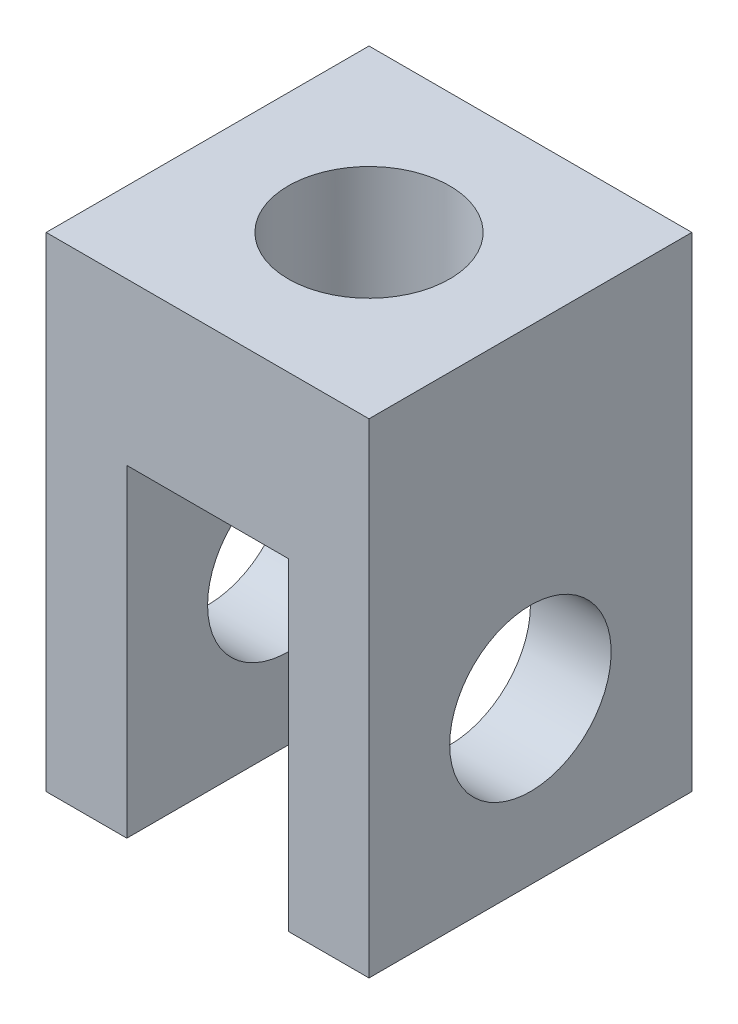
ISO-10303-21;
HEADER;
FILE_DESCRIPTION(('STEP AP214'),'2;1');
FILE_NAME('part.step','',(''),(''),'','','');
FILE_SCHEMA(('AUTOMOTIVE_DESIGN { 1 0 10303 214 1 1 1 1 }'));
ENDSEC;
DATA;
#1=APPLICATION_CONTEXT('core data for automotive mechanical design processes');
#2=APPLICATION_PROTOCOL_DEFINITION('international standard','automotive_design',2000,#1);
#3=PRODUCT_CONTEXT('',#1,'mechanical');
#4=PRODUCT('Part','Part','',(#3));
#5=PRODUCT_RELATED_PRODUCT_CATEGORY('part','',(#4));
#6=PRODUCT_DEFINITION_FORMATION('','',#4);
#7=PRODUCT_DEFINITION_CONTEXT('part definition',#1,'design');
#8=PRODUCT_DEFINITION('design','',#6,#7);
#9=PRODUCT_DEFINITION_SHAPE('','',#8);
#10=(LENGTH_UNIT() NAMED_UNIT(*) SI_UNIT(.MILLI.,.METRE.));
#11=(NAMED_UNIT(*) PLANE_ANGLE_UNIT() SI_UNIT($,.RADIAN.));
#12=(NAMED_UNIT(*) SI_UNIT($,.STERADIAN.) SOLID_ANGLE_UNIT());
#13=UNCERTAINTY_MEASURE_WITH_UNIT(LENGTH_MEASURE(1.E-05),#10,'distance_accuracy_value','');
#14=(GEOMETRIC_REPRESENTATION_CONTEXT(3) GLOBAL_UNCERTAINTY_ASSIGNED_CONTEXT((#13)) GLOBAL_UNIT_ASSIGNED_CONTEXT((#10,
#11,#12)) REPRESENTATION_CONTEXT('',''));
#15=CARTESIAN_POINT('',(0.,0.,0.));
#16=DIRECTION('',(0.,0.,1.));
#17=DIRECTION('',(1.,0.,0.));
#18=AXIS2_PLACEMENT_3D('',#15,#16,#17);
#19=CARTESIAN_POINT('',(0.,0.,0.));
#20=DIRECTION('',(0.,1.,0.));
#21=DIRECTION('',(0.,0.,1.));
#22=AXIS2_PLACEMENT_3D('',#19,#20,#21);
#23=PLANE('',#22);
#24=DIRECTION('',(0.,0.,-1.));
#25=VECTOR('',#24,1.);
#26=CARTESIAN_POINT('',(5.,0.,10.));
#27=LINE('',#26,#25);
#28=CARTESIAN_POINT('',(5.,0.,10.));
#29=VERTEX_POINT('',#28);
#30=CARTESIAN_POINT('',(5.,0.,0.));
#31=VERTEX_POINT('',#30);
#32=EDGE_CURVE('E137',#29,#31,#27,.T.);
#33=ORIENTED_EDGE('',*,*,#32,.F.);
#34=DIRECTION('',(1.,0.,0.));
#35=VECTOR('',#34,1.);
#36=CARTESIAN_POINT('',(-9.99999999999999,0.,10.));
#37=LINE('',#36,#35);
#38=CARTESIAN_POINT('',(-5.,0.,10.));
#39=VERTEX_POINT('',#38);
#40=EDGE_CURVE('E175',#39,#29,#37,.T.);
#41=ORIENTED_EDGE('',*,*,#40,.F.);
#42=DIRECTION('',(0.,0.,1.));
#43=VECTOR('',#42,1.);
#44=CARTESIAN_POINT('',(-5.,0.,10.));
#45=LINE('',#44,#43);
#46=CARTESIAN_POINT('',(-5.,0.,0.));
#47=VERTEX_POINT('',#46);
#48=EDGE_CURVE('E11',#47,#39,#45,.T.);
#49=ORIENTED_EDGE('',*,*,#48,.F.);
#50=CARTESIAN_POINT('',(0.,0.,0.));
#51=DIRECTION('',(0.,1.,0.));
#52=DIRECTION('',(0.,0.,1.));
#53=AXIS2_PLACEMENT_3D('',#50,#51,#52);
#54=CIRCLE('',#53,5.);
#55=EDGE_CURVE('E168',#47,#31,#54,.T.);
#56=ORIENTED_EDGE('',*,*,#55,.T.);
#57=EDGE_LOOP('',(#33,#41,#49,#56));
#58=FACE_BOUND('',#57,.T.);
#59=ADVANCED_FACE('F34',(#58),#23,.F.);
#60=CARTESIAN_POINT('',(5.,0.,-10.));
#61=VERTEX_POINT('',#60);
#62=EDGE_CURVE('E139',#31,#61,#27,.T.);
#63=ORIENTED_EDGE('',*,*,#62,.F.);
#64=EDGE_CURVE('E59',#31,#47,#54,.T.);
#65=ORIENTED_EDGE('',*,*,#64,.T.);
#66=CARTESIAN_POINT('',(-5.,0.,-10.));
#67=VERTEX_POINT('',#66);
#68=EDGE_CURVE('E45',#67,#47,#45,.T.);
#69=ORIENTED_EDGE('',*,*,#68,.F.);
#70=DIRECTION('',(-1.,0.,0.));
#71=VECTOR('',#70,1.);
#72=CARTESIAN_POINT('',(-10.,0.,-10.));
#73=LINE('',#72,#71);
#74=EDGE_CURVE('E52',#61,#67,#73,.T.);
#75=ORIENTED_EDGE('',*,*,#74,.F.);
#76=EDGE_LOOP('',(#63,#65,#69,#75));
#77=FACE_BOUND('',#76,.T.);
#78=ADVANCED_FACE('F207',(#77),#23,.F.);
#79=CARTESIAN_POINT('',(10.,10.,-10.));
#80=DIRECTION('',(-1.,0.,0.));
#81=DIRECTION('',(0.,0.,1.));
#82=AXIS2_PLACEMENT_3D('',#79,#80,#81);
#83=PLANE('',#82);
#84=CARTESIAN_POINT('',(10.,-10.,0.));
#85=DIRECTION('',(-1.,0.,0.));
#86=DIRECTION('',(0.,0.,1.));
#87=AXIS2_PLACEMENT_3D('',#84,#85,#86);
#88=CIRCLE('',#87,5.);
#89=CARTESIAN_POINT('',(10.,-10.,5.));
#90=VERTEX_POINT('',#89);
#91=EDGE_CURVE('E238',#90,#90,#88,.T.);
#92=ORIENTED_EDGE('',*,*,#91,.T.);
#93=EDGE_LOOP('',(#92));
#94=FACE_BOUND('',#93,.T.);
#95=DIRECTION('',(0.,-1.,0.));
#96=VECTOR('',#95,1.);
#97=CARTESIAN_POINT('',(10.,10.,10.));
#98=LINE('',#97,#96);
#99=CARTESIAN_POINT('',(10.,10.,10.));
#100=VERTEX_POINT('',#99);
#101=CARTESIAN_POINT('',(10.,-20.,10.));
#102=VERTEX_POINT('',#101);
#103=EDGE_CURVE('E112',#100,#102,#98,.T.);
#104=ORIENTED_EDGE('',*,*,#103,.T.);
#105=DIRECTION('',(0.,0.,1.));
#106=VECTOR('',#105,1.);
#107=CARTESIAN_POINT('',(10.,-20.,10.));
#108=LINE('',#107,#106);
#109=CARTESIAN_POINT('',(10.,-20.,-10.));
#110=VERTEX_POINT('',#109);
#111=EDGE_CURVE('E116',#110,#102,#108,.T.);
#112=ORIENTED_EDGE('',*,*,#111,.F.);
#113=DIRECTION('',(0.,-1.,0.));
#114=VECTOR('',#113,1.);
#115=CARTESIAN_POINT('',(10.,10.,-10.));
#116=LINE('',#115,#114);
#117=CARTESIAN_POINT('',(10.,10.,-10.));
#118=VERTEX_POINT('',#117);
#119=EDGE_CURVE('E43',#118,#110,#116,.T.);
#120=ORIENTED_EDGE('',*,*,#119,.F.);
#121=DIRECTION('',(0.,0.,-1.));
#122=VECTOR('',#121,1.);
#123=CARTESIAN_POINT('',(10.,10.,-10.));
#124=LINE('',#123,#122);
#125=EDGE_CURVE('E118',#100,#118,#124,.T.);
#126=ORIENTED_EDGE('',*,*,#125,.F.);
#127=EDGE_LOOP('',(#104,#112,#120,#126));
#128=FACE_BOUND('',#127,.T.);
#129=ADVANCED_FACE('F36',(#94,#128),#83,.F.);
#130=CARTESIAN_POINT('',(-10.,10.,-10.));
#131=DIRECTION('',(0.,0.,1.));
#132=DIRECTION('',(1.,0.,0.));
#133=AXIS2_PLACEMENT_3D('',#130,#131,#132);
#134=PLANE('',#133);
#135=ORIENTED_EDGE('',*,*,#119,.T.);
#136=DIRECTION('',(1.,0.,0.));
#137=VECTOR('',#136,1.);
#138=CARTESIAN_POINT('',(10.,-20.,-10.));
#139=LINE('',#138,#137);
#140=CARTESIAN_POINT('',(5.,-20.,-10.));
#141=VERTEX_POINT('',#140);
#142=EDGE_CURVE('E136',#141,#110,#139,.T.);
#143=ORIENTED_EDGE('',*,*,#142,.F.);
#144=DIRECTION('',(0.,1.,0.));
#145=VECTOR('',#144,1.);
#146=CARTESIAN_POINT('',(5.,-20.,-10.));
#147=LINE('',#146,#145);
#148=EDGE_CURVE('E146',#141,#61,#147,.T.);
#149=ORIENTED_EDGE('',*,*,#148,.T.);
#150=ORIENTED_EDGE('',*,*,#74,.T.);
#151=DIRECTION('',(0.,1.,0.));
#152=VECTOR('',#151,1.);
#153=CARTESIAN_POINT('',(-5.,-20.,-10.));
#154=LINE('',#153,#152);
#155=CARTESIAN_POINT('',(-5.,-20.,-10.));
#156=VERTEX_POINT('',#155);
#157=EDGE_CURVE('E164',#156,#67,#154,.T.);
#158=ORIENTED_EDGE('',*,*,#157,.F.);
#159=DIRECTION('',(1.,0.,0.));
#160=VECTOR('',#159,1.);
#161=CARTESIAN_POINT('',(-10.,-20.,-10.));
#162=LINE('',#161,#160);
#163=CARTESIAN_POINT('',(-10.,-20.,-10.));
#164=VERTEX_POINT('',#163);
#165=EDGE_CURVE('E153',#164,#156,#162,.T.);
#166=ORIENTED_EDGE('',*,*,#165,.F.);
#167=DIRECTION('',(0.,-1.,0.));
#168=VECTOR('',#167,1.);
#169=CARTESIAN_POINT('',(-10.,10.,-10.));
#170=LINE('',#169,#168);
#171=CARTESIAN_POINT('',(-10.,10.,-10.));
#172=VERTEX_POINT('',#171);
#173=EDGE_CURVE('E183',#172,#164,#170,.T.);
#174=ORIENTED_EDGE('',*,*,#173,.F.);
#175=DIRECTION('',(-1.,0.,0.));
#176=VECTOR('',#175,1.);
#177=CARTESIAN_POINT('',(-10.,10.,-10.));
#178=LINE('',#177,#176);
#179=EDGE_CURVE('E174',#118,#172,#178,.T.);
#180=ORIENTED_EDGE('',*,*,#179,.F.);
#181=EDGE_LOOP('',(#135,#143,#149,#150,#158,#166,#174,#180));
#182=FACE_BOUND('',#181,.T.);
#183=ADVANCED_FACE('F184',(#182),#134,.F.);
#184=CARTESIAN_POINT('',(-10.,10.,-10.));
#185=DIRECTION('',(1.,0.,0.));
#186=DIRECTION('',(0.,0.,-1.));
#187=AXIS2_PLACEMENT_3D('',#184,#185,#186);
#188=PLANE('',#187);
#189=CARTESIAN_POINT('',(-10.,-10.,0.));
#190=DIRECTION('',(-1.,0.,0.));
#191=DIRECTION('',(0.,0.,1.));
#192=AXIS2_PLACEMENT_3D('',#189,#190,#191);
#193=CIRCLE('',#192,5.);
#194=CARTESIAN_POINT('',(-9.99999999999999,-10.,5.));
#195=VERTEX_POINT('',#194);
#196=EDGE_CURVE('E240',#195,#195,#193,.T.);
#197=ORIENTED_EDGE('',*,*,#196,.F.);
#198=EDGE_LOOP('',(#197));
#199=FACE_BOUND('',#198,.T.);
#200=ORIENTED_EDGE('',*,*,#173,.T.);
#201=DIRECTION('',(0.,0.,-1.));
#202=VECTOR('',#201,1.);
#203=CARTESIAN_POINT('',(-10.,-20.,10.));
#204=LINE('',#203,#202);
#205=CARTESIAN_POINT('',(-10.,-20.,10.));
#206=VERTEX_POINT('',#205);
#207=EDGE_CURVE('E150',#206,#164,#204,.T.);
#208=ORIENTED_EDGE('',*,*,#207,.F.);
#209=DIRECTION('',(0.,-1.,0.));
#210=VECTOR('',#209,1.);
#211=CARTESIAN_POINT('',(-9.99999999999999,10.,10.));
#212=LINE('',#211,#210);
#213=CARTESIAN_POINT('',(-9.99999999999999,10.,10.));
#214=VERTEX_POINT('',#213);
#215=EDGE_CURVE('E121',#214,#206,#212,.T.);
#216=ORIENTED_EDGE('',*,*,#215,.F.);
#217=DIRECTION('',(0.,0.,1.));
#218=VECTOR('',#217,1.);
#219=CARTESIAN_POINT('',(-10.,10.,-10.));
#220=LINE('',#219,#218);
#221=EDGE_CURVE('E177',#172,#214,#220,.T.);
#222=ORIENTED_EDGE('',*,*,#221,.F.);
#223=EDGE_LOOP('',(#200,#208,#216,#222));
#224=FACE_BOUND('',#223,.T.);
#225=ADVANCED_FACE('F198',(#199,#224),#188,.F.);
#226=CARTESIAN_POINT('',(-9.99999999999999,10.,10.));
#227=DIRECTION('',(0.,0.,-1.));
#228=DIRECTION('',(-1.,0.,0.));
#229=AXIS2_PLACEMENT_3D('',#226,#227,#228);
#230=PLANE('',#229);
#231=ORIENTED_EDGE('',*,*,#215,.T.);
#232=DIRECTION('',(-1.,0.,0.));
#233=VECTOR('',#232,1.);
#234=CARTESIAN_POINT('',(-10.,-20.,10.));
#235=LINE('',#234,#233);
#236=CARTESIAN_POINT('',(-5.,-20.,10.));
#237=VERTEX_POINT('',#236);
#238=EDGE_CURVE('E157',#237,#206,#235,.T.);
#239=ORIENTED_EDGE('',*,*,#238,.F.);
#240=DIRECTION('',(0.,1.,0.));
#241=VECTOR('',#240,1.);
#242=CARTESIAN_POINT('',(-5.,-20.,10.));
#243=LINE('',#242,#241);
#244=EDGE_CURVE('E159',#237,#39,#243,.T.);
#245=ORIENTED_EDGE('',*,*,#244,.T.);
#246=ORIENTED_EDGE('',*,*,#40,.T.);
#247=DIRECTION('',(0.,1.,0.));
#248=VECTOR('',#247,1.);
#249=CARTESIAN_POINT('',(5.,-20.,10.));
#250=LINE('',#249,#248);
#251=CARTESIAN_POINT('',(5.,-20.,10.));
#252=VERTEX_POINT('',#251);
#253=EDGE_CURVE('E128',#252,#29,#250,.T.);
#254=ORIENTED_EDGE('',*,*,#253,.F.);
#255=DIRECTION('',(-1.,0.,0.));
#256=VECTOR('',#255,1.);
#257=CARTESIAN_POINT('',(10.,-20.,10.));
#258=LINE('',#257,#256);
#259=EDGE_CURVE('E125',#102,#252,#258,.T.);
#260=ORIENTED_EDGE('',*,*,#259,.F.);
#261=ORIENTED_EDGE('',*,*,#103,.F.);
#262=DIRECTION('',(1.,0.,0.));
#263=VECTOR('',#262,1.);
#264=CARTESIAN_POINT('',(-9.99999999999999,10.,10.));
#265=LINE('',#264,#263);
#266=EDGE_CURVE('E122',#214,#100,#265,.T.);
#267=ORIENTED_EDGE('',*,*,#266,.F.);
#268=EDGE_LOOP('',(#231,#239,#245,#246,#254,#260,#261,#267));
#269=FACE_BOUND('',#268,.T.);
#270=ADVANCED_FACE('F126',(#269),#230,.F.);
#271=CARTESIAN_POINT('',(0.,10.,0.));
#272=DIRECTION('',(0.,1.,0.));
#273=DIRECTION('',(0.,0.,1.));
#274=AXIS2_PLACEMENT_3D('',#271,#272,#273);
#275=PLANE('',#274);
#276=CARTESIAN_POINT('',(0.,10.,0.));
#277=DIRECTION('',(0.,1.,0.));
#278=DIRECTION('',(0.,0.,1.));
#279=AXIS2_PLACEMENT_3D('',#276,#277,#278);
#280=CIRCLE('',#279,5.);
#281=CARTESIAN_POINT('',(0.,10.,5.));
#282=VERTEX_POINT('',#281);
#283=EDGE_CURVE('E167',#282,#282,#280,.T.);
#284=ORIENTED_EDGE('',*,*,#283,.F.);
#285=EDGE_LOOP('',(#284));
#286=FACE_BOUND('',#285,.T.);
#287=ORIENTED_EDGE('',*,*,#125,.T.);
#288=ORIENTED_EDGE('',*,*,#179,.T.);
#289=ORIENTED_EDGE('',*,*,#221,.T.);
#290=ORIENTED_EDGE('',*,*,#266,.T.);
#291=EDGE_LOOP('',(#287,#288,#289,#290));
#292=FACE_BOUND('',#291,.T.);
#293=ADVANCED_FACE('F189',(#286,#292),#275,.T.);
#294=CARTESIAN_POINT('',(0.,0.,0.));
#295=DIRECTION('',(0.,1.,0.));
#296=DIRECTION('',(0.,0.,1.));
#297=AXIS2_PLACEMENT_3D('',#294,#295,#296);
#298=CYLINDRICAL_SURFACE('',#297,5.);
#299=ORIENTED_EDGE('',*,*,#55,.F.);
#300=ORIENTED_EDGE('',*,*,#64,.F.);
#301=EDGE_LOOP('',(#299,#300));
#302=FACE_BOUND('',#301,.T.);
#303=ORIENTED_EDGE('',*,*,#283,.T.);
#304=EDGE_LOOP('',(#303));
#305=FACE_BOUND('',#304,.T.);
#306=ADVANCED_FACE('F209',(#302,#305),#298,.F.);
#307=CARTESIAN_POINT('',(-5.,-20.,10.));
#308=DIRECTION('',(-1.,0.,0.));
#309=DIRECTION('',(0.,0.,1.));
#310=AXIS2_PLACEMENT_3D('',#307,#308,#309);
#311=PLANE('',#310);
#312=CARTESIAN_POINT('',(-5.,-10.,0.));
#313=DIRECTION('',(-1.,0.,0.));
#314=DIRECTION('',(0.,0.,1.));
#315=AXIS2_PLACEMENT_3D('',#312,#313,#314);
#316=CIRCLE('',#315,5.);
#317=CARTESIAN_POINT('',(-5.,-10.,5.));
#318=VERTEX_POINT('',#317);
#319=EDGE_CURVE('E142',#318,#318,#316,.T.);
#320=ORIENTED_EDGE('',*,*,#319,.T.);
#321=EDGE_LOOP('',(#320));
#322=FACE_BOUND('',#321,.T.);
#323=ORIENTED_EDGE('',*,*,#68,.T.);
#324=ORIENTED_EDGE('',*,*,#48,.T.);
#325=ORIENTED_EDGE('',*,*,#244,.F.);
#326=DIRECTION('',(0.,0.,1.));
#327=VECTOR('',#326,1.);
#328=CARTESIAN_POINT('',(-5.,-20.,10.));
#329=LINE('',#328,#327);
#330=EDGE_CURVE('E155',#156,#237,#329,.T.);
#331=ORIENTED_EDGE('',*,*,#330,.F.);
#332=ORIENTED_EDGE('',*,*,#157,.T.);
#333=EDGE_LOOP('',(#323,#324,#325,#331,#332));
#334=FACE_BOUND('',#333,.T.);
#335=ADVANCED_FACE('F200',(#322,#334),#311,.F.);
#336=CARTESIAN_POINT('',(0.,-20.,0.));
#337=DIRECTION('',(0.,-1.,0.));
#338=DIRECTION('',(0.,0.,-1.));
#339=AXIS2_PLACEMENT_3D('',#336,#337,#338);
#340=PLANE('',#339);
#341=ORIENTED_EDGE('',*,*,#207,.T.);
#342=ORIENTED_EDGE('',*,*,#165,.T.);
#343=ORIENTED_EDGE('',*,*,#330,.T.);
#344=ORIENTED_EDGE('',*,*,#238,.T.);
#345=EDGE_LOOP('',(#341,#342,#343,#344));
#346=FACE_BOUND('',#345,.T.);
#347=ADVANCED_FACE('F195',(#346),#340,.T.);
#348=CARTESIAN_POINT('',(5.,-20.,10.));
#349=DIRECTION('',(1.,0.,0.));
#350=DIRECTION('',(0.,0.,-1.));
#351=AXIS2_PLACEMENT_3D('',#348,#349,#350);
#352=PLANE('',#351);
#353=CARTESIAN_POINT('',(5.,-10.,0.));
#354=DIRECTION('',(1.,0.,0.));
#355=DIRECTION('',(0.,0.,-1.));
#356=AXIS2_PLACEMENT_3D('',#353,#354,#355);
#357=CIRCLE('',#356,5.);
#358=CARTESIAN_POINT('',(5.,-10.,-5.));
#359=VERTEX_POINT('',#358);
#360=EDGE_CURVE('E38',#359,#359,#357,.T.);
#361=ORIENTED_EDGE('',*,*,#360,.T.);
#362=EDGE_LOOP('',(#361));
#363=FACE_BOUND('',#362,.T.);
#364=ORIENTED_EDGE('',*,*,#32,.T.);
#365=ORIENTED_EDGE('',*,*,#62,.T.);
#366=ORIENTED_EDGE('',*,*,#148,.F.);
#367=DIRECTION('',(0.,0.,-1.));
#368=VECTOR('',#367,1.);
#369=CARTESIAN_POINT('',(5.,-20.,10.));
#370=LINE('',#369,#368);
#371=EDGE_CURVE('E131',#252,#141,#370,.T.);
#372=ORIENTED_EDGE('',*,*,#371,.F.);
#373=ORIENTED_EDGE('',*,*,#253,.T.);
#374=EDGE_LOOP('',(#364,#365,#366,#372,#373));
#375=FACE_BOUND('',#374,.T.);
#376=ADVANCED_FACE('F205',(#363,#375),#352,.F.);
#377=CARTESIAN_POINT('',(0.,-20.,0.));
#378=DIRECTION('',(0.,1.,0.));
#379=DIRECTION('',(0.,0.,1.));
#380=AXIS2_PLACEMENT_3D('',#377,#378,#379);
#381=PLANE('',#380);
#382=ORIENTED_EDGE('',*,*,#111,.T.);
#383=ORIENTED_EDGE('',*,*,#259,.T.);
#384=ORIENTED_EDGE('',*,*,#371,.T.);
#385=ORIENTED_EDGE('',*,*,#142,.T.);
#386=EDGE_LOOP('',(#382,#383,#384,#385));
#387=FACE_BOUND('',#386,.T.);
#388=ADVANCED_FACE('F134',(#387),#381,.F.);
#389=CARTESIAN_POINT('',(10.,-10.,0.));
#390=DIRECTION('',(-1.,0.,0.));
#391=DIRECTION('',(0.,0.,1.));
#392=AXIS2_PLACEMENT_3D('',#389,#390,#391);
#393=CYLINDRICAL_SURFACE('',#392,5.);
#394=ORIENTED_EDGE('',*,*,#91,.F.);
#395=EDGE_LOOP('',(#394));
#396=FACE_BOUND('',#395,.T.);
#397=ORIENTED_EDGE('',*,*,#360,.F.);
#398=EDGE_LOOP('',(#397));
#399=FACE_BOUND('',#398,.T.);
#400=ADVANCED_FACE('F249',(#396,#399),#393,.F.);
#401=ORIENTED_EDGE('',*,*,#196,.T.);
#402=EDGE_LOOP('',(#401));
#403=FACE_BOUND('',#402,.T.);
#404=ORIENTED_EDGE('',*,*,#319,.F.);
#405=EDGE_LOOP('',(#404));
#406=FACE_BOUND('',#405,.T.);
#407=ADVANCED_FACE('F246',(#403,#406),#393,.F.);
#408=CLOSED_SHELL('',(#59,#78,#129,#183,#225,#270,#293,#306,#335,#347,#376,#388,#400,#407));
#409=MANIFOLD_SOLID_BREP('B2',#408);
#410=ADVANCED_BREP_SHAPE_REPRESENTATION('',(#18,#409),#14);
#411=SHAPE_DEFINITION_REPRESENTATION(#9,#410);
ENDSEC;
END-ISO-10303-21;
